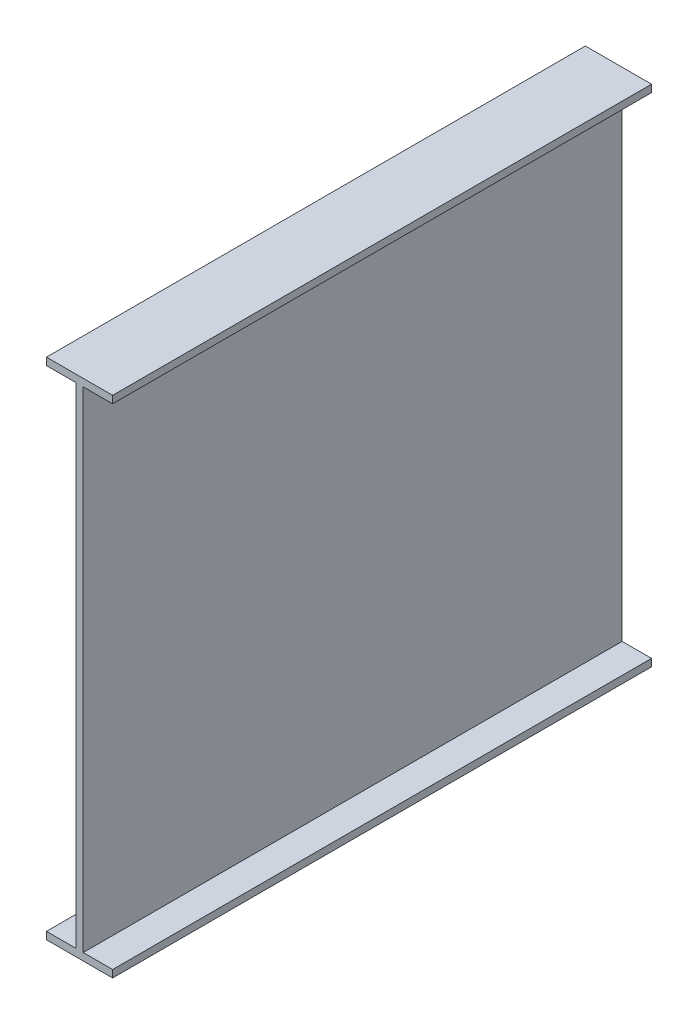
ISO-10303-21;
HEADER;
FILE_DESCRIPTION(('STEP AP214'),'2;1');
FILE_NAME('part.step','',(''),(''),'','','');
FILE_SCHEMA(('AUTOMOTIVE_DESIGN { 1 0 10303 214 1 1 1 1 }'));
ENDSEC;
DATA;
#1=APPLICATION_CONTEXT('core data for automotive mechanical design processes');
#2=APPLICATION_PROTOCOL_DEFINITION('international standard','automotive_design',2000,#1);
#3=PRODUCT_CONTEXT('',#1,'mechanical');
#4=PRODUCT('Part','Part','',(#3));
#5=PRODUCT_RELATED_PRODUCT_CATEGORY('part','',(#4));
#6=PRODUCT_DEFINITION_FORMATION('','',#4);
#7=PRODUCT_DEFINITION_CONTEXT('part definition',#1,'design');
#8=PRODUCT_DEFINITION('design','',#6,#7);
#9=PRODUCT_DEFINITION_SHAPE('','',#8);
#10=(LENGTH_UNIT() NAMED_UNIT(*) SI_UNIT(.MILLI.,.METRE.));
#11=(NAMED_UNIT(*) PLANE_ANGLE_UNIT() SI_UNIT($,.RADIAN.));
#12=(NAMED_UNIT(*) SI_UNIT($,.STERADIAN.) SOLID_ANGLE_UNIT());
#13=UNCERTAINTY_MEASURE_WITH_UNIT(LENGTH_MEASURE(1.E-05),#10,'distance_accuracy_value','');
#14=(GEOMETRIC_REPRESENTATION_CONTEXT(3) GLOBAL_UNCERTAINTY_ASSIGNED_CONTEXT((#13)) GLOBAL_UNIT_ASSIGNED_CONTEXT((#10,
#11,#12)) REPRESENTATION_CONTEXT('',''));
#15=CARTESIAN_POINT('',(0.,0.,0.));
#16=DIRECTION('',(0.,0.,1.));
#17=DIRECTION('',(1.,0.,0.));
#18=AXIS2_PLACEMENT_3D('',#15,#16,#17);
#19=CARTESIAN_POINT('',(-1.5,100.,220.));
#20=DIRECTION('',(0.,1.,0.));
#21=DIRECTION('',(-1.,0.,0.));
#22=AXIS2_PLACEMENT_3D('',#19,#20,#21);
#23=PLANE('',#22);
#24=DIRECTION('',(1.,0.,0.));
#25=VECTOR('',#24,1.);
#26=CARTESIAN_POINT('',(-1.5,100.,0.));
#27=LINE('',#26,#25);
#28=CARTESIAN_POINT('',(-13.5,99.9999999999999,0.));
#29=VERTEX_POINT('',#28);
#30=CARTESIAN_POINT('',(-1.5,100.,0.));
#31=VERTEX_POINT('',#30);
#32=EDGE_CURVE('E157',#29,#31,#27,.T.);
#33=ORIENTED_EDGE('',*,*,#32,.T.);
#34=DIRECTION('',(0.,0.,-1.));
#35=VECTOR('',#34,1.);
#36=CARTESIAN_POINT('',(-1.5,100.,220.));
#37=LINE('',#36,#35);
#38=CARTESIAN_POINT('',(-1.5,100.,220.));
#39=VERTEX_POINT('',#38);
#40=EDGE_CURVE('E11',#39,#31,#37,.T.);
#41=ORIENTED_EDGE('',*,*,#40,.F.);
#42=DIRECTION('',(1.,0.,0.));
#43=VECTOR('',#42,1.);
#44=CARTESIAN_POINT('',(-1.5,100.,220.));
#45=LINE('',#44,#43);
#46=CARTESIAN_POINT('',(-13.5,99.9999999999999,220.));
#47=VERTEX_POINT('',#46);
#48=EDGE_CURVE('E180',#47,#39,#45,.T.);
#49=ORIENTED_EDGE('',*,*,#48,.F.);
#50=DIRECTION('',(0.,0.,-1.));
#51=VECTOR('',#50,1.);
#52=CARTESIAN_POINT('',(-13.5,99.9999999999999,220.));
#53=LINE('',#52,#51);
#54=EDGE_CURVE('E153',#47,#29,#53,.T.);
#55=ORIENTED_EDGE('',*,*,#54,.T.);
#56=EDGE_LOOP('',(#33,#41,#49,#55));
#57=FACE_BOUND('',#56,.T.);
#58=ADVANCED_FACE('F37',(#57),#23,.F.);
#59=CARTESIAN_POINT('',(-1.5,-100.,220.));
#60=DIRECTION('',(1.,0.,0.));
#61=DIRECTION('',(0.,0.,-1.));
#62=AXIS2_PLACEMENT_3D('',#59,#60,#61);
#63=PLANE('',#62);
#64=DIRECTION('',(0.,-1.,0.));
#65=VECTOR('',#64,1.);
#66=CARTESIAN_POINT('',(-1.5,-100.,0.));
#67=LINE('',#66,#65);
#68=CARTESIAN_POINT('',(-1.5,-100.,0.));
#69=VERTEX_POINT('',#68);
#70=EDGE_CURVE('E160',#31,#69,#67,.T.);
#71=ORIENTED_EDGE('',*,*,#70,.T.);
#72=DIRECTION('',(0.,0.,-1.));
#73=VECTOR('',#72,1.);
#74=CARTESIAN_POINT('',(-1.5,-100.,220.));
#75=LINE('',#74,#73);
#76=CARTESIAN_POINT('',(-1.5,-100.,220.));
#77=VERTEX_POINT('',#76);
#78=EDGE_CURVE('E45',#77,#69,#75,.T.);
#79=ORIENTED_EDGE('',*,*,#78,.F.);
#80=DIRECTION('',(0.,-1.,0.));
#81=VECTOR('',#80,1.);
#82=CARTESIAN_POINT('',(-1.5,-100.,220.));
#83=LINE('',#82,#81);
#84=EDGE_CURVE('E107',#39,#77,#83,.T.);
#85=ORIENTED_EDGE('',*,*,#84,.F.);
#86=ORIENTED_EDGE('',*,*,#40,.T.);
#87=EDGE_LOOP('',(#71,#79,#85,#86));
#88=FACE_BOUND('',#87,.T.);
#89=ADVANCED_FACE('F257',(#88),#63,.F.);
#90=CARTESIAN_POINT('',(-1.5,-100.,220.));
#91=DIRECTION('',(0.,-1.,0.));
#92=DIRECTION('',(1.,0.,0.));
#93=AXIS2_PLACEMENT_3D('',#90,#91,#92);
#94=PLANE('',#93);
#95=DIRECTION('',(-1.,0.,0.));
#96=VECTOR('',#95,1.);
#97=CARTESIAN_POINT('',(-1.5,-100.,0.));
#98=LINE('',#97,#96);
#99=CARTESIAN_POINT('',(-13.5,-99.9999999999999,0.));
#100=VERTEX_POINT('',#99);
#101=EDGE_CURVE('E162',#69,#100,#98,.T.);
#102=ORIENTED_EDGE('',*,*,#101,.T.);
#103=DIRECTION('',(0.,0.,-1.));
#104=VECTOR('',#103,1.);
#105=CARTESIAN_POINT('',(-13.5,-99.9999999999999,220.));
#106=LINE('',#105,#104);
#107=CARTESIAN_POINT('',(-13.5,-99.9999999999999,220.));
#108=VERTEX_POINT('',#107);
#109=EDGE_CURVE('E199',#108,#100,#106,.T.);
#110=ORIENTED_EDGE('',*,*,#109,.F.);
#111=DIRECTION('',(-1.,0.,0.));
#112=VECTOR('',#111,1.);
#113=CARTESIAN_POINT('',(-1.5,-100.,220.));
#114=LINE('',#113,#112);
#115=EDGE_CURVE('E207',#77,#108,#114,.T.);
#116=ORIENTED_EDGE('',*,*,#115,.F.);
#117=ORIENTED_EDGE('',*,*,#78,.T.);
#118=EDGE_LOOP('',(#102,#110,#116,#117));
#119=FACE_BOUND('',#118,.T.);
#120=ADVANCED_FACE('F205',(#119),#94,.F.);
#121=CARTESIAN_POINT('',(-13.5,-99.9999999999999,220.));
#122=DIRECTION('',(1.,0.,0.));
#123=DIRECTION('',(0.,0.,-1.));
#124=AXIS2_PLACEMENT_3D('',#121,#122,#123);
#125=PLANE('',#124);
#126=DIRECTION('',(0.,-1.,0.));
#127=VECTOR('',#126,1.);
#128=CARTESIAN_POINT('',(-13.5,-99.9999999999999,0.));
#129=LINE('',#128,#127);
#130=CARTESIAN_POINT('',(-13.5,-103.,0.));
#131=VERTEX_POINT('',#130);
#132=EDGE_CURVE('E164',#100,#131,#129,.T.);
#133=ORIENTED_EDGE('',*,*,#132,.T.);
#134=DIRECTION('',(0.,0.,-1.));
#135=VECTOR('',#134,1.);
#136=CARTESIAN_POINT('',(-13.5,-103.,220.));
#137=LINE('',#136,#135);
#138=CARTESIAN_POINT('',(-13.5,-103.,220.));
#139=VERTEX_POINT('',#138);
#140=EDGE_CURVE('E196',#139,#131,#137,.T.);
#141=ORIENTED_EDGE('',*,*,#140,.F.);
#142=DIRECTION('',(0.,-1.,0.));
#143=VECTOR('',#142,1.);
#144=CARTESIAN_POINT('',(-13.5,-99.9999999999999,220.));
#145=LINE('',#144,#143);
#146=EDGE_CURVE('E224',#108,#139,#145,.T.);
#147=ORIENTED_EDGE('',*,*,#146,.F.);
#148=ORIENTED_EDGE('',*,*,#109,.T.);
#149=EDGE_LOOP('',(#133,#141,#147,#148));
#150=FACE_BOUND('',#149,.T.);
#151=ADVANCED_FACE('F215',(#150),#125,.F.);
#152=CARTESIAN_POINT('',(-1.5,-103.,220.));
#153=DIRECTION('',(0.,1.,0.));
#154=DIRECTION('',(0.,0.,1.));
#155=AXIS2_PLACEMENT_3D('',#152,#153,#154);
#156=PLANE('',#155);
#157=DIRECTION('',(1.,0.,0.));
#158=VECTOR('',#157,1.);
#159=CARTESIAN_POINT('',(-1.5,-103.,0.));
#160=LINE('',#159,#158);
#161=CARTESIAN_POINT('',(13.5,-103.,0.));
#162=VERTEX_POINT('',#161);
#163=EDGE_CURVE('E167',#131,#162,#160,.T.);
#164=ORIENTED_EDGE('',*,*,#163,.T.);
#165=DIRECTION('',(0.,0.,-1.));
#166=VECTOR('',#165,1.);
#167=CARTESIAN_POINT('',(13.5,-103.,220.));
#168=LINE('',#167,#166);
#169=CARTESIAN_POINT('',(13.5,-103.,220.));
#170=VERTEX_POINT('',#169);
#171=EDGE_CURVE('E193',#170,#162,#168,.T.);
#172=ORIENTED_EDGE('',*,*,#171,.F.);
#173=DIRECTION('',(1.,0.,0.));
#174=VECTOR('',#173,1.);
#175=CARTESIAN_POINT('',(-13.5,-103.,220.));
#176=LINE('',#175,#174);
#177=EDGE_CURVE('E221',#139,#170,#176,.T.);
#178=ORIENTED_EDGE('',*,*,#177,.F.);
#179=ORIENTED_EDGE('',*,*,#140,.T.);
#180=EDGE_LOOP('',(#164,#172,#178,#179));
#181=FACE_BOUND('',#180,.T.);
#182=ADVANCED_FACE('F219',(#181),#156,.F.);
#183=CARTESIAN_POINT('',(13.5,-103.,220.));
#184=DIRECTION('',(-1.,0.,0.));
#185=DIRECTION('',(0.,0.,1.));
#186=AXIS2_PLACEMENT_3D('',#183,#184,#185);
#187=PLANE('',#186);
#188=DIRECTION('',(0.,1.,0.));
#189=VECTOR('',#188,1.);
#190=CARTESIAN_POINT('',(13.5,-103.,0.));
#191=LINE('',#190,#189);
#192=CARTESIAN_POINT('',(13.5,-100.,0.));
#193=VERTEX_POINT('',#192);
#194=EDGE_CURVE('E169',#162,#193,#191,.T.);
#195=ORIENTED_EDGE('',*,*,#194,.T.);
#196=DIRECTION('',(0.,0.,-1.));
#197=VECTOR('',#196,1.);
#198=CARTESIAN_POINT('',(13.5,-100.,220.));
#199=LINE('',#198,#197);
#200=CARTESIAN_POINT('',(13.5,-100.,220.));
#201=VERTEX_POINT('',#200);
#202=EDGE_CURVE('E190',#201,#193,#199,.T.);
#203=ORIENTED_EDGE('',*,*,#202,.F.);
#204=DIRECTION('',(0.,1.,0.));
#205=VECTOR('',#204,1.);
#206=CARTESIAN_POINT('',(13.5,-103.,220.));
#207=LINE('',#206,#205);
#208=EDGE_CURVE('E223',#170,#201,#207,.T.);
#209=ORIENTED_EDGE('',*,*,#208,.F.);
#210=ORIENTED_EDGE('',*,*,#171,.T.);
#211=EDGE_LOOP('',(#195,#203,#209,#210));
#212=FACE_BOUND('',#211,.T.);
#213=ADVANCED_FACE('F270',(#212),#187,.F.);
#214=CARTESIAN_POINT('',(13.5,-100.,220.));
#215=DIRECTION('',(0.,-1.,0.));
#216=DIRECTION('',(0.,0.,-1.));
#217=AXIS2_PLACEMENT_3D('',#214,#215,#216);
#218=PLANE('',#217);
#219=DIRECTION('',(-1.,0.,0.));
#220=VECTOR('',#219,1.);
#221=CARTESIAN_POINT('',(13.5,-100.,0.));
#222=LINE('',#221,#220);
#223=CARTESIAN_POINT('',(1.5,-100.,0.));
#224=VERTEX_POINT('',#223);
#225=EDGE_CURVE('E171',#193,#224,#222,.T.);
#226=ORIENTED_EDGE('',*,*,#225,.T.);
#227=DIRECTION('',(0.,0.,-1.));
#228=VECTOR('',#227,1.);
#229=CARTESIAN_POINT('',(1.5,-100.,220.));
#230=LINE('',#229,#228);
#231=CARTESIAN_POINT('',(1.5,-100.,220.));
#232=VERTEX_POINT('',#231);
#233=EDGE_CURVE('E187',#232,#224,#230,.T.);
#234=ORIENTED_EDGE('',*,*,#233,.F.);
#235=DIRECTION('',(-1.,0.,0.));
#236=VECTOR('',#235,1.);
#237=CARTESIAN_POINT('',(13.5,-100.,220.));
#238=LINE('',#237,#236);
#239=EDGE_CURVE('E226',#201,#232,#238,.T.);
#240=ORIENTED_EDGE('',*,*,#239,.F.);
#241=ORIENTED_EDGE('',*,*,#202,.T.);
#242=EDGE_LOOP('',(#226,#234,#240,#241));
#243=FACE_BOUND('',#242,.T.);
#244=ADVANCED_FACE('F273',(#243),#218,.F.);
#245=CARTESIAN_POINT('',(1.5,-100.,220.));
#246=DIRECTION('',(-1.,0.,0.));
#247=DIRECTION('',(0.,0.,1.));
#248=AXIS2_PLACEMENT_3D('',#245,#246,#247);
#249=PLANE('',#248);
#250=DIRECTION('',(0.,1.,0.));
#251=VECTOR('',#250,1.);
#252=CARTESIAN_POINT('',(1.5,-100.,0.));
#253=LINE('',#252,#251);
#254=CARTESIAN_POINT('',(1.5,100.,0.));
#255=VERTEX_POINT('',#254);
#256=EDGE_CURVE('E173',#224,#255,#253,.T.);
#257=ORIENTED_EDGE('',*,*,#256,.T.);
#258=DIRECTION('',(0.,0.,-1.));
#259=VECTOR('',#258,1.);
#260=CARTESIAN_POINT('',(1.5,100.,220.));
#261=LINE('',#260,#259);
#262=CARTESIAN_POINT('',(1.5,100.,220.));
#263=VERTEX_POINT('',#262);
#264=EDGE_CURVE('E184',#263,#255,#261,.T.);
#265=ORIENTED_EDGE('',*,*,#264,.F.);
#266=DIRECTION('',(0.,1.,0.));
#267=VECTOR('',#266,1.);
#268=CARTESIAN_POINT('',(1.5,-100.,220.));
#269=LINE('',#268,#267);
#270=EDGE_CURVE('E232',#232,#263,#269,.T.);
#271=ORIENTED_EDGE('',*,*,#270,.F.);
#272=ORIENTED_EDGE('',*,*,#233,.T.);
#273=EDGE_LOOP('',(#257,#265,#271,#272));
#274=FACE_BOUND('',#273,.T.);
#275=ADVANCED_FACE('F238',(#274),#249,.F.);
#276=CARTESIAN_POINT('',(13.5,100.,220.));
#277=DIRECTION('',(0.,1.,0.));
#278=DIRECTION('',(0.,0.,1.));
#279=AXIS2_PLACEMENT_3D('',#276,#277,#278);
#280=PLANE('',#279);
#281=DIRECTION('',(1.,0.,0.));
#282=VECTOR('',#281,1.);
#283=CARTESIAN_POINT('',(13.5,100.,0.));
#284=LINE('',#283,#282);
#285=CARTESIAN_POINT('',(13.5,100.,0.));
#286=VERTEX_POINT('',#285);
#287=EDGE_CURVE('E175',#255,#286,#284,.T.);
#288=ORIENTED_EDGE('',*,*,#287,.T.);
#289=DIRECTION('',(0.,0.,-1.));
#290=VECTOR('',#289,1.);
#291=CARTESIAN_POINT('',(13.5,100.,220.));
#292=LINE('',#291,#290);
#293=CARTESIAN_POINT('',(13.5,100.,220.));
#294=VERTEX_POINT('',#293);
#295=EDGE_CURVE('E148',#294,#286,#292,.T.);
#296=ORIENTED_EDGE('',*,*,#295,.F.);
#297=DIRECTION('',(1.,0.,0.));
#298=VECTOR('',#297,1.);
#299=CARTESIAN_POINT('',(13.5,100.,220.));
#300=LINE('',#299,#298);
#301=EDGE_CURVE('E138',#263,#294,#300,.T.);
#302=ORIENTED_EDGE('',*,*,#301,.F.);
#303=ORIENTED_EDGE('',*,*,#264,.T.);
#304=EDGE_LOOP('',(#288,#296,#302,#303));
#305=FACE_BOUND('',#304,.T.);
#306=ADVANCED_FACE('F242',(#305),#280,.F.);
#307=CARTESIAN_POINT('',(13.5,103.,220.));
#308=DIRECTION('',(-1.,0.,0.));
#309=DIRECTION('',(0.,0.,1.));
#310=AXIS2_PLACEMENT_3D('',#307,#308,#309);
#311=PLANE('',#310);
#312=DIRECTION('',(0.,1.,0.));
#313=VECTOR('',#312,1.);
#314=CARTESIAN_POINT('',(13.5,103.,0.));
#315=LINE('',#314,#313);
#316=CARTESIAN_POINT('',(13.5,103.,0.));
#317=VERTEX_POINT('',#316);
#318=EDGE_CURVE('E147',#286,#317,#315,.T.);
#319=ORIENTED_EDGE('',*,*,#318,.T.);
#320=DIRECTION('',(0.,0.,-1.));
#321=VECTOR('',#320,1.);
#322=CARTESIAN_POINT('',(13.5,103.,220.));
#323=LINE('',#322,#321);
#324=CARTESIAN_POINT('',(13.5,103.,220.));
#325=VERTEX_POINT('',#324);
#326=EDGE_CURVE('E144',#325,#317,#323,.T.);
#327=ORIENTED_EDGE('',*,*,#326,.F.);
#328=DIRECTION('',(0.,1.,0.));
#329=VECTOR('',#328,1.);
#330=CARTESIAN_POINT('',(13.5,103.,220.));
#331=LINE('',#330,#329);
#332=EDGE_CURVE('E132',#294,#325,#331,.T.);
#333=ORIENTED_EDGE('',*,*,#332,.F.);
#334=ORIENTED_EDGE('',*,*,#295,.T.);
#335=EDGE_LOOP('',(#319,#327,#333,#334));
#336=FACE_BOUND('',#335,.T.);
#337=ADVANCED_FACE('F145',(#336),#311,.F.);
#338=CARTESIAN_POINT('',(-13.5,103.,220.));
#339=DIRECTION('',(0.,-1.,0.));
#340=DIRECTION('',(0.,0.,-1.));
#341=AXIS2_PLACEMENT_3D('',#338,#339,#340);
#342=PLANE('',#341);
#343=DIRECTION('',(-1.,0.,0.));
#344=VECTOR('',#343,1.);
#345=CARTESIAN_POINT('',(-13.5,103.,0.));
#346=LINE('',#345,#344);
#347=CARTESIAN_POINT('',(-13.5,103.,0.));
#348=VERTEX_POINT('',#347);
#349=EDGE_CURVE('E93',#317,#348,#346,.T.);
#350=ORIENTED_EDGE('',*,*,#349,.T.);
#351=DIRECTION('',(0.,0.,-1.));
#352=VECTOR('',#351,1.);
#353=CARTESIAN_POINT('',(-13.5,103.,220.));
#354=LINE('',#353,#352);
#355=CARTESIAN_POINT('',(-13.5,103.,220.));
#356=VERTEX_POINT('',#355);
#357=EDGE_CURVE('E149',#356,#348,#354,.T.);
#358=ORIENTED_EDGE('',*,*,#357,.F.);
#359=DIRECTION('',(-1.,0.,0.));
#360=VECTOR('',#359,1.);
#361=CARTESIAN_POINT('',(-1.5,103.,220.));
#362=LINE('',#361,#360);
#363=EDGE_CURVE('E136',#325,#356,#362,.T.);
#364=ORIENTED_EDGE('',*,*,#363,.F.);
#365=ORIENTED_EDGE('',*,*,#326,.T.);
#366=EDGE_LOOP('',(#350,#358,#364,#365));
#367=FACE_BOUND('',#366,.T.);
#368=ADVANCED_FACE('F151',(#367),#342,.F.);
#369=CARTESIAN_POINT('',(-13.5,99.9999999999999,220.));
#370=DIRECTION('',(1.,0.,0.));
#371=DIRECTION('',(0.,0.,-1.));
#372=AXIS2_PLACEMENT_3D('',#369,#370,#371);
#373=PLANE('',#372);
#374=DIRECTION('',(0.,-1.,0.));
#375=VECTOR('',#374,1.);
#376=CARTESIAN_POINT('',(-13.5,99.9999999999999,0.));
#377=LINE('',#376,#375);
#378=EDGE_CURVE('E99',#348,#29,#377,.T.);
#379=ORIENTED_EDGE('',*,*,#378,.T.);
#380=ORIENTED_EDGE('',*,*,#54,.F.);
#381=DIRECTION('',(0.,-1.,0.));
#382=VECTOR('',#381,1.);
#383=CARTESIAN_POINT('',(-13.5,99.9999999999999,220.));
#384=LINE('',#383,#382);
#385=EDGE_CURVE('E53',#356,#47,#384,.T.);
#386=ORIENTED_EDGE('',*,*,#385,.F.);
#387=ORIENTED_EDGE('',*,*,#357,.T.);
#388=EDGE_LOOP('',(#379,#380,#386,#387));
#389=FACE_BOUND('',#388,.T.);
#390=ADVANCED_FACE('F246',(#389),#373,.F.);
#391=CARTESIAN_POINT('',(0.,0.,220.));
#392=DIRECTION('',(0.,0.,-1.));
#393=DIRECTION('',(-1.,0.,0.));
#394=AXIS2_PLACEMENT_3D('',#391,#392,#393);
#395=PLANE('',#394);
#396=ORIENTED_EDGE('',*,*,#48,.T.);
#397=ORIENTED_EDGE('',*,*,#84,.T.);
#398=ORIENTED_EDGE('',*,*,#115,.T.);
#399=ORIENTED_EDGE('',*,*,#146,.T.);
#400=ORIENTED_EDGE('',*,*,#177,.T.);
#401=ORIENTED_EDGE('',*,*,#208,.T.);
#402=ORIENTED_EDGE('',*,*,#239,.T.);
#403=ORIENTED_EDGE('',*,*,#270,.T.);
#404=ORIENTED_EDGE('',*,*,#301,.T.);
#405=ORIENTED_EDGE('',*,*,#332,.T.);
#406=ORIENTED_EDGE('',*,*,#363,.T.);
#407=ORIENTED_EDGE('',*,*,#385,.T.);
#408=EDGE_LOOP('',(#396,#397,#398,#399,#400,#401,#402,#403,#404,#405,#406,#407));
#409=FACE_BOUND('',#408,.T.);
#410=ADVANCED_FACE('F134',(#409),#395,.F.);
#411=CARTESIAN_POINT('',(0.,0.,0.));
#412=DIRECTION('',(0.,0.,-1.));
#413=DIRECTION('',(-1.,0.,0.));
#414=AXIS2_PLACEMENT_3D('',#411,#412,#413);
#415=PLANE('',#414);
#416=ORIENTED_EDGE('',*,*,#32,.F.);
#417=ORIENTED_EDGE('',*,*,#378,.F.);
#418=ORIENTED_EDGE('',*,*,#349,.F.);
#419=ORIENTED_EDGE('',*,*,#318,.F.);
#420=ORIENTED_EDGE('',*,*,#287,.F.);
#421=ORIENTED_EDGE('',*,*,#256,.F.);
#422=ORIENTED_EDGE('',*,*,#225,.F.);
#423=ORIENTED_EDGE('',*,*,#194,.F.);
#424=ORIENTED_EDGE('',*,*,#163,.F.);
#425=ORIENTED_EDGE('',*,*,#132,.F.);
#426=ORIENTED_EDGE('',*,*,#101,.F.);
#427=ORIENTED_EDGE('',*,*,#70,.F.);
#428=EDGE_LOOP('',(#416,#417,#418,#419,#420,#421,#422,#423,#424,#425,#426,#427));
#429=FACE_BOUND('',#428,.T.);
#430=ADVANCED_FACE('F211',(#429),#415,.T.);
#431=CLOSED_SHELL('',(#58,#89,#120,#151,#182,#213,#244,#275,#306,#337,#368,#390,#410,#430));
#432=MANIFOLD_SOLID_BREP('B2',#431);
#433=ADVANCED_BREP_SHAPE_REPRESENTATION('',(#18,#432),#14);
#434=SHAPE_DEFINITION_REPRESENTATION(#9,#433);
ENDSEC;
END-ISO-10303-21;
